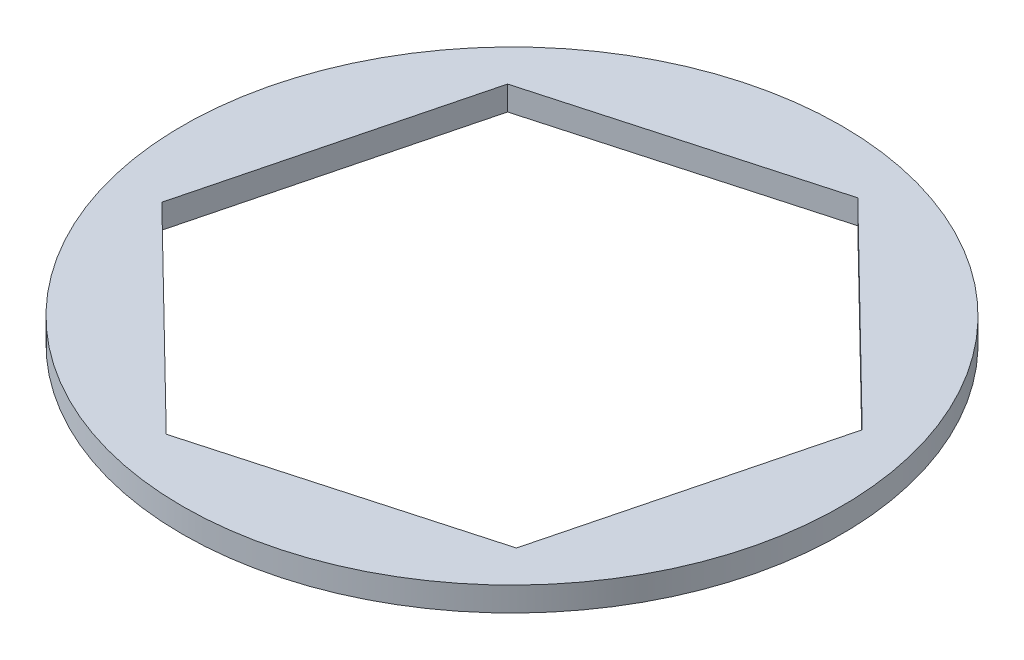
ISO-10303-21;
HEADER;
FILE_DESCRIPTION(('STEP AP214'),'2;1');
FILE_NAME('part.step','',(''),(''),'','','');
FILE_SCHEMA(('AUTOMOTIVE_DESIGN { 1 0 10303 214 1 1 1 1 }'));
ENDSEC;
DATA;
#1=APPLICATION_CONTEXT('core data for automotive mechanical design processes');
#2=APPLICATION_PROTOCOL_DEFINITION('international standard','automotive_design',2000,#1);
#3=PRODUCT_CONTEXT('',#1,'mechanical');
#4=PRODUCT('Part','Part','',(#3));
#5=PRODUCT_RELATED_PRODUCT_CATEGORY('part','',(#4));
#6=PRODUCT_DEFINITION_FORMATION('','',#4);
#7=PRODUCT_DEFINITION_CONTEXT('part definition',#1,'design');
#8=PRODUCT_DEFINITION('design','',#6,#7);
#9=PRODUCT_DEFINITION_SHAPE('','',#8);
#10=(LENGTH_UNIT() NAMED_UNIT(*) SI_UNIT(.MILLI.,.METRE.));
#11=(NAMED_UNIT(*) PLANE_ANGLE_UNIT() SI_UNIT($,.RADIAN.));
#12=(NAMED_UNIT(*) SI_UNIT($,.STERADIAN.) SOLID_ANGLE_UNIT());
#13=UNCERTAINTY_MEASURE_WITH_UNIT(LENGTH_MEASURE(1.E-05),#10,'distance_accuracy_value','');
#14=(GEOMETRIC_REPRESENTATION_CONTEXT(3) GLOBAL_UNCERTAINTY_ASSIGNED_CONTEXT((#13)) GLOBAL_UNIT_ASSIGNED_CONTEXT((#10,
#11,#12)) REPRESENTATION_CONTEXT('',''));
#15=CARTESIAN_POINT('',(0.,0.,0.));
#16=DIRECTION('',(0.,0.,1.));
#17=DIRECTION('',(1.,0.,0.));
#18=AXIS2_PLACEMENT_3D('',#15,#16,#17);
#19=CARTESIAN_POINT('',(0.,0.7,0.));
#20=DIRECTION('',(0.,1.,0.));
#21=DIRECTION('',(0.,0.,1.));
#22=AXIS2_PLACEMENT_3D('',#19,#20,#21);
#23=PLANE('',#22);
#24=CARTESIAN_POINT('',(0.,0.7,0.));
#25=DIRECTION('',(0.,1.,0.));
#26=DIRECTION('',(0.,0.,1.));
#27=AXIS2_PLACEMENT_3D('',#24,#25,#26);
#28=CIRCLE('',#27,9.525);
#29=CARTESIAN_POINT('',(0.,0.7,9.525));
#30=VERTEX_POINT('',#29);
#31=EDGE_CURVE('E11',#30,#30,#28,.T.);
#32=ORIENTED_EDGE('',*,*,#31,.T.);
#33=EDGE_LOOP('',(#32));
#34=FACE_BOUND('',#33,.T.);
#35=DIRECTION('',(-0.963021635811925,0.,0.269424069002984));
#36=VECTOR('',#35,1.);
#37=CARTESIAN_POINT('',(2.03813371562612,0.7,-7.95529611583135));
#38=LINE('',#37,#36);
#39=CARTESIAN_POINT('',(2.03813371562612,0.7,-7.95529611583135));
#40=VERTEX_POINT('',#39);
#41=CARTESIAN_POINT('',(-5.87042167312456,0.7,-5.74272363195747));
#42=VERTEX_POINT('',#41);
#43=EDGE_CURVE('E98',#40,#42,#38,.T.);
#44=ORIENTED_EDGE('',*,*,#43,.F.);
#45=DIRECTION('',(-0.714838906053518,0.,-0.699289166505681));
#46=VECTOR('',#45,1.);
#47=CARTESIAN_POINT('',(7.90855538875068,0.7,-2.21257248387389));
#48=LINE('',#47,#46);
#49=CARTESIAN_POINT('',(7.90855538875068,0.7,-2.21257248387389));
#50=VERTEX_POINT('',#49);
#51=EDGE_CURVE('E90',#50,#40,#48,.T.);
#52=ORIENTED_EDGE('',*,*,#51,.F.);
#53=DIRECTION('',(0.248182729758407,0.,-0.968713235508665));
#54=VECTOR('',#53,1.);
#55=CARTESIAN_POINT('',(5.87042167312456,0.7,5.74272363195747));
#56=LINE('',#55,#54);
#57=CARTESIAN_POINT('',(5.87042167312456,0.7,5.74272363195747));
#58=VERTEX_POINT('',#57);
#59=EDGE_CURVE('E118',#58,#50,#56,.T.);
#60=ORIENTED_EDGE('',*,*,#59,.F.);
#61=DIRECTION('',(0.963021635811925,0.,-0.269424069002984));
#62=VECTOR('',#61,1.);
#63=CARTESIAN_POINT('',(-2.03813371562611,0.7,7.95529611583135));
#64=LINE('',#63,#62);
#65=CARTESIAN_POINT('',(-2.03813371562611,0.7,7.95529611583135));
#66=VERTEX_POINT('',#65);
#67=EDGE_CURVE('E116',#66,#58,#64,.T.);
#68=ORIENTED_EDGE('',*,*,#67,.F.);
#69=DIRECTION('',(0.714838906053518,0.,0.699289166505681));
#70=VECTOR('',#69,1.);
#71=CARTESIAN_POINT('',(-7.90855538875068,0.7,2.21257248387389));
#72=LINE('',#71,#70);
#73=CARTESIAN_POINT('',(-7.90855538875068,0.7,2.21257248387389));
#74=VERTEX_POINT('',#73);
#75=EDGE_CURVE('E112',#74,#66,#72,.T.);
#76=ORIENTED_EDGE('',*,*,#75,.F.);
#77=DIRECTION('',(-0.248182729758406,0.,0.968713235508665));
#78=VECTOR('',#77,1.);
#79=CARTESIAN_POINT('',(-5.87042167312456,0.7,-5.74272363195747));
#80=LINE('',#79,#78);
#81=EDGE_CURVE('E110',#42,#74,#80,.T.);
#82=ORIENTED_EDGE('',*,*,#81,.F.);
#83=EDGE_LOOP('',(#44,#52,#60,#68,#76,#82));
#84=FACE_BOUND('',#83,.T.);
#85=ADVANCED_FACE('F37',(#34,#84),#23,.T.);
#86=CARTESIAN_POINT('',(0.,0.,0.));
#87=DIRECTION('',(0.,1.,0.));
#88=DIRECTION('',(0.,0.,1.));
#89=AXIS2_PLACEMENT_3D('',#86,#87,#88);
#90=PLANE('',#89);
#91=CARTESIAN_POINT('',(0.,0.,0.));
#92=DIRECTION('',(0.,1.,0.));
#93=DIRECTION('',(0.,0.,1.));
#94=AXIS2_PLACEMENT_3D('',#91,#92,#93);
#95=CIRCLE('',#94,9.525);
#96=CARTESIAN_POINT('',(0.,0.,9.525));
#97=VERTEX_POINT('',#96);
#98=EDGE_CURVE('E41',#97,#97,#95,.T.);
#99=ORIENTED_EDGE('',*,*,#98,.F.);
#100=EDGE_LOOP('',(#99));
#101=FACE_BOUND('',#100,.T.);
#102=DIRECTION('',(-0.714838906053518,0.,-0.699289166505681));
#103=VECTOR('',#102,1.);
#104=CARTESIAN_POINT('',(7.90855538875068,0.,-2.21257248387389));
#105=LINE('',#104,#103);
#106=CARTESIAN_POINT('',(7.90855538875068,0.,-2.21257248387389));
#107=VERTEX_POINT('',#106);
#108=CARTESIAN_POINT('',(2.03813371562612,0.,-7.95529611583135));
#109=VERTEX_POINT('',#108);
#110=EDGE_CURVE('E60',#107,#109,#105,.T.);
#111=ORIENTED_EDGE('',*,*,#110,.T.);
#112=DIRECTION('',(-0.963021635811925,0.,0.269424069002984));
#113=VECTOR('',#112,1.);
#114=CARTESIAN_POINT('',(2.03813371562612,0.,-7.95529611583135));
#115=LINE('',#114,#113);
#116=CARTESIAN_POINT('',(-5.87042167312456,0.,-5.74272363195747));
#117=VERTEX_POINT('',#116);
#118=EDGE_CURVE('E105',#109,#117,#115,.T.);
#119=ORIENTED_EDGE('',*,*,#118,.T.);
#120=DIRECTION('',(-0.248182729758406,0.,0.968713235508665));
#121=VECTOR('',#120,1.);
#122=CARTESIAN_POINT('',(-5.87042167312456,0.,-5.74272363195747));
#123=LINE('',#122,#121);
#124=CARTESIAN_POINT('',(-7.90855538875068,0.,2.21257248387389));
#125=VERTEX_POINT('',#124);
#126=EDGE_CURVE('E122',#117,#125,#123,.T.);
#127=ORIENTED_EDGE('',*,*,#126,.T.);
#128=DIRECTION('',(0.714838906053518,0.,0.699289166505681));
#129=VECTOR('',#128,1.);
#130=CARTESIAN_POINT('',(-7.90855538875068,0.,2.21257248387389));
#131=LINE('',#130,#129);
#132=CARTESIAN_POINT('',(-2.03813371562611,0.,7.95529611583135));
#133=VERTEX_POINT('',#132);
#134=EDGE_CURVE('E125',#125,#133,#131,.T.);
#135=ORIENTED_EDGE('',*,*,#134,.T.);
#136=DIRECTION('',(0.963021635811925,0.,-0.269424069002984));
#137=VECTOR('',#136,1.);
#138=CARTESIAN_POINT('',(-2.03813371562611,0.,7.95529611583135));
#139=LINE('',#138,#137);
#140=CARTESIAN_POINT('',(5.87042167312456,0.,5.74272363195747));
#141=VERTEX_POINT('',#140);
#142=EDGE_CURVE('E128',#133,#141,#139,.T.);
#143=ORIENTED_EDGE('',*,*,#142,.T.);
#144=DIRECTION('',(0.248182729758407,0.,-0.968713235508665));
#145=VECTOR('',#144,1.);
#146=CARTESIAN_POINT('',(5.87042167312456,0.,5.74272363195747));
#147=LINE('',#146,#145);
#148=EDGE_CURVE('E99',#141,#107,#147,.T.);
#149=ORIENTED_EDGE('',*,*,#148,.T.);
#150=EDGE_LOOP('',(#111,#119,#127,#135,#143,#149));
#151=FACE_BOUND('',#150,.T.);
#152=ADVANCED_FACE('F145',(#101,#151),#90,.F.);
#153=CARTESIAN_POINT('',(0.,0.7,0.));
#154=DIRECTION('',(0.,-1.,0.));
#155=DIRECTION('',(0.,0.,-1.));
#156=AXIS2_PLACEMENT_3D('',#153,#154,#155);
#157=CYLINDRICAL_SURFACE('',#156,9.525);
#158=ORIENTED_EDGE('',*,*,#31,.F.);
#159=EDGE_LOOP('',(#158));
#160=FACE_BOUND('',#159,.T.);
#161=ORIENTED_EDGE('',*,*,#98,.T.);
#162=EDGE_LOOP('',(#161));
#163=FACE_BOUND('',#162,.T.);
#164=ADVANCED_FACE('F39',(#160,#163),#157,.T.);
#165=CARTESIAN_POINT('',(7.90855538875068,0.7,-2.21257248387389));
#166=DIRECTION('',(-0.699289166505681,0.,0.714838906053518));
#167=DIRECTION('',(0.714838906053518,0.,0.699289166505681));
#168=AXIS2_PLACEMENT_3D('',#165,#166,#167);
#169=PLANE('',#168);
#170=ORIENTED_EDGE('',*,*,#110,.F.);
#171=DIRECTION('',(0.,-1.,0.));
#172=VECTOR('',#171,1.);
#173=CARTESIAN_POINT('',(7.90855538875068,0.7,-2.21257248387389));
#174=LINE('',#173,#172);
#175=EDGE_CURVE('E94',#50,#107,#174,.T.);
#176=ORIENTED_EDGE('',*,*,#175,.F.);
#177=ORIENTED_EDGE('',*,*,#51,.T.);
#178=DIRECTION('',(0.,-1.,0.));
#179=VECTOR('',#178,1.);
#180=CARTESIAN_POINT('',(2.03813371562612,0.7,-7.95529611583135));
#181=LINE('',#180,#179);
#182=EDGE_CURVE('E93',#40,#109,#181,.T.);
#183=ORIENTED_EDGE('',*,*,#182,.T.);
#184=EDGE_LOOP('',(#170,#176,#177,#183));
#185=FACE_BOUND('',#184,.T.);
#186=ADVANCED_FACE('F92',(#185),#169,.T.);
#187=CARTESIAN_POINT('',(2.03813371562612,0.7,-7.95529611583135));
#188=DIRECTION('',(0.269424069002984,0.,0.963021635811925));
#189=DIRECTION('',(0.963021635811925,0.,-0.269424069002984));
#190=AXIS2_PLACEMENT_3D('',#187,#188,#189);
#191=PLANE('',#190);
#192=ORIENTED_EDGE('',*,*,#118,.F.);
#193=ORIENTED_EDGE('',*,*,#182,.F.);
#194=ORIENTED_EDGE('',*,*,#43,.T.);
#195=DIRECTION('',(0.,-1.,0.));
#196=VECTOR('',#195,1.);
#197=CARTESIAN_POINT('',(-5.87042167312456,0.7,-5.74272363195747));
#198=LINE('',#197,#196);
#199=EDGE_CURVE('E106',#42,#117,#198,.T.);
#200=ORIENTED_EDGE('',*,*,#199,.T.);
#201=EDGE_LOOP('',(#192,#193,#194,#200));
#202=FACE_BOUND('',#201,.T.);
#203=ADVANCED_FACE('F102',(#202),#191,.T.);
#204=CARTESIAN_POINT('',(-5.87042167312456,0.7,-5.74272363195747));
#205=DIRECTION('',(0.968713235508665,0.,0.248182729758406));
#206=DIRECTION('',(0.248182729758406,0.,-0.968713235508665));
#207=AXIS2_PLACEMENT_3D('',#204,#205,#206);
#208=PLANE('',#207);
#209=ORIENTED_EDGE('',*,*,#126,.F.);
#210=ORIENTED_EDGE('',*,*,#199,.F.);
#211=ORIENTED_EDGE('',*,*,#81,.T.);
#212=DIRECTION('',(0.,-1.,0.));
#213=VECTOR('',#212,1.);
#214=CARTESIAN_POINT('',(-7.90855538875068,0.7,2.21257248387389));
#215=LINE('',#214,#213);
#216=EDGE_CURVE('E137',#74,#125,#215,.T.);
#217=ORIENTED_EDGE('',*,*,#216,.T.);
#218=EDGE_LOOP('',(#209,#210,#211,#217));
#219=FACE_BOUND('',#218,.T.);
#220=ADVANCED_FACE('F141',(#219),#208,.T.);
#221=CARTESIAN_POINT('',(-7.90855538875068,0.7,2.21257248387389));
#222=DIRECTION('',(0.699289166505681,0.,-0.714838906053518));
#223=DIRECTION('',(-0.714838906053518,0.,-0.699289166505681));
#224=AXIS2_PLACEMENT_3D('',#221,#222,#223);
#225=PLANE('',#224);
#226=ORIENTED_EDGE('',*,*,#134,.F.);
#227=ORIENTED_EDGE('',*,*,#216,.F.);
#228=ORIENTED_EDGE('',*,*,#75,.T.);
#229=DIRECTION('',(0.,-1.,0.));
#230=VECTOR('',#229,1.);
#231=CARTESIAN_POINT('',(-2.03813371562611,0.7,7.95529611583135));
#232=LINE('',#231,#230);
#233=EDGE_CURVE('E135',#66,#133,#232,.T.);
#234=ORIENTED_EDGE('',*,*,#233,.T.);
#235=EDGE_LOOP('',(#226,#227,#228,#234));
#236=FACE_BOUND('',#235,.T.);
#237=ADVANCED_FACE('F153',(#236),#225,.T.);
#238=CARTESIAN_POINT('',(-2.03813371562611,0.7,7.95529611583135));
#239=DIRECTION('',(-0.269424069002984,0.,-0.963021635811925));
#240=DIRECTION('',(-0.963021635811925,0.,0.269424069002984));
#241=AXIS2_PLACEMENT_3D('',#238,#239,#240);
#242=PLANE('',#241);
#243=ORIENTED_EDGE('',*,*,#142,.F.);
#244=ORIENTED_EDGE('',*,*,#233,.F.);
#245=ORIENTED_EDGE('',*,*,#67,.T.);
#246=DIRECTION('',(0.,-1.,0.));
#247=VECTOR('',#246,1.);
#248=CARTESIAN_POINT('',(5.87042167312456,0.7,5.74272363195747));
#249=LINE('',#248,#247);
#250=EDGE_CURVE('E52',#58,#141,#249,.T.);
#251=ORIENTED_EDGE('',*,*,#250,.T.);
#252=EDGE_LOOP('',(#243,#244,#245,#251));
#253=FACE_BOUND('',#252,.T.);
#254=ADVANCED_FACE('F151',(#253),#242,.T.);
#255=CARTESIAN_POINT('',(5.87042167312456,0.7,5.74272363195747));
#256=DIRECTION('',(-0.968713235508665,0.,-0.248182729758407));
#257=DIRECTION('',(-0.248182729758407,0.,0.968713235508665));
#258=AXIS2_PLACEMENT_3D('',#255,#256,#257);
#259=PLANE('',#258);
#260=ORIENTED_EDGE('',*,*,#148,.F.);
#261=ORIENTED_EDGE('',*,*,#250,.F.);
#262=ORIENTED_EDGE('',*,*,#59,.T.);
#263=ORIENTED_EDGE('',*,*,#175,.T.);
#264=EDGE_LOOP('',(#260,#261,#262,#263));
#265=FACE_BOUND('',#264,.T.);
#266=ADVANCED_FACE('F147',(#265),#259,.T.);
#267=CLOSED_SHELL('',(#85,#152,#164,#186,#203,#220,#237,#254,#266));
#268=MANIFOLD_SOLID_BREP('B2',#267);
#269=ADVANCED_BREP_SHAPE_REPRESENTATION('',(#18,#268),#14);
#270=SHAPE_DEFINITION_REPRESENTATION(#9,#269);
ENDSEC;
END-ISO-10303-21;
